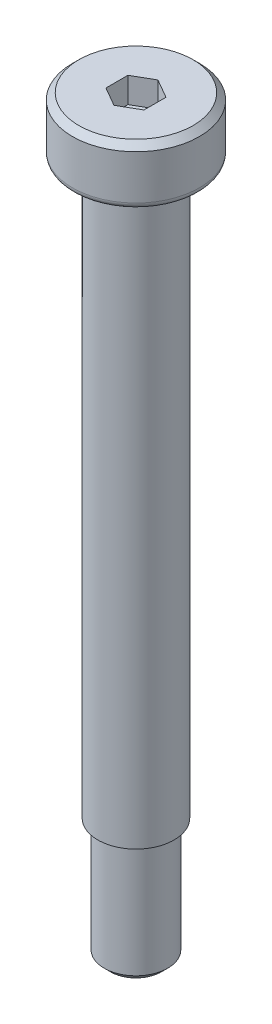
ISO-10303-21;
HEADER;
FILE_DESCRIPTION(('STEP AP214'),'2;1');
FILE_NAME('part.step','',(''),(''),'','','');
FILE_SCHEMA(('AUTOMOTIVE_DESIGN { 1 0 10303 214 1 1 1 1 }'));
ENDSEC;
DATA;
#1=APPLICATION_CONTEXT('core data for automotive mechanical design processes');
#2=APPLICATION_PROTOCOL_DEFINITION('international standard','automotive_design',2000,#1);
#3=PRODUCT_CONTEXT('',#1,'mechanical');
#4=PRODUCT('Part','Part','',(#3));
#5=PRODUCT_RELATED_PRODUCT_CATEGORY('part','',(#4));
#6=PRODUCT_DEFINITION_FORMATION('','',#4);
#7=PRODUCT_DEFINITION_CONTEXT('part definition',#1,'design');
#8=PRODUCT_DEFINITION('design','',#6,#7);
#9=PRODUCT_DEFINITION_SHAPE('','',#8);
#10=(LENGTH_UNIT() NAMED_UNIT(*) SI_UNIT(.MILLI.,.METRE.));
#11=(NAMED_UNIT(*) PLANE_ANGLE_UNIT() SI_UNIT($,.RADIAN.));
#12=(NAMED_UNIT(*) SI_UNIT($,.STERADIAN.) SOLID_ANGLE_UNIT());
#13=UNCERTAINTY_MEASURE_WITH_UNIT(LENGTH_MEASURE(1.E-05),#10,'distance_accuracy_value','');
#14=(GEOMETRIC_REPRESENTATION_CONTEXT(3) GLOBAL_UNCERTAINTY_ASSIGNED_CONTEXT((#13)) GLOBAL_UNIT_ASSIGNED_CONTEXT((#10,
#11,#12)) REPRESENTATION_CONTEXT('',''));
#15=CARTESIAN_POINT('',(0.,0.,0.));
#16=DIRECTION('',(0.,0.,1.));
#17=DIRECTION('',(1.,0.,0.));
#18=AXIS2_PLACEMENT_3D('',#15,#16,#17);
#19=CARTESIAN_POINT('',(0.,0.,0.));
#20=DIRECTION('',(0.,-1.,0.));
#21=DIRECTION('',(1.,0.,0.));
#22=AXIS2_PLACEMENT_3D('',#19,#20,#21);
#23=PLANE('',#22);
#24=CARTESIAN_POINT('',(0.,0.,0.));
#25=DIRECTION('',(0.,-1.,0.));
#26=DIRECTION('',(1.,0.,0.));
#27=AXIS2_PLACEMENT_3D('',#24,#25,#26);
#28=CIRCLE('',#27,4.5);
#29=CARTESIAN_POINT('',(4.5,0.,0.));
#30=VERTEX_POINT('',#29);
#31=EDGE_CURVE('E166',#30,#30,#28,.F.);
#32=ORIENTED_EDGE('',*,*,#31,.T.);
#33=EDGE_LOOP('',(#32));
#34=FACE_BOUND('',#33,.T.);
#35=DIRECTION('',(0.866025403784439,0.,-0.5));
#36=VECTOR('',#35,1.);
#37=CARTESIAN_POINT('',(0.,0.,1.73205080756888));
#38=LINE('',#37,#36);
#39=CARTESIAN_POINT('',(0.,0.,1.73205080756888));
#40=VERTEX_POINT('',#39);
#41=CARTESIAN_POINT('',(1.5,0.,0.866025403784439));
#42=VERTEX_POINT('',#41);
#43=EDGE_CURVE('E133',#40,#42,#38,.T.);
#44=ORIENTED_EDGE('',*,*,#43,.F.);
#45=DIRECTION('',(0.866025403784439,0.,0.5));
#46=VECTOR('',#45,1.);
#47=CARTESIAN_POINT('',(-1.5,0.,0.866025403784438));
#48=LINE('',#47,#46);
#49=CARTESIAN_POINT('',(-1.5,0.,0.866025403784438));
#50=VERTEX_POINT('',#49);
#51=EDGE_CURVE('E59',#50,#40,#48,.T.);
#52=ORIENTED_EDGE('',*,*,#51,.F.);
#53=DIRECTION('',(0.,0.,1.));
#54=VECTOR('',#53,1.);
#55=CARTESIAN_POINT('',(-1.5,0.,-0.866025403784439));
#56=LINE('',#55,#54);
#57=CARTESIAN_POINT('',(-1.5,0.,-0.866025403784439));
#58=VERTEX_POINT('',#57);
#59=EDGE_CURVE('E142',#58,#50,#56,.T.);
#60=ORIENTED_EDGE('',*,*,#59,.F.);
#61=DIRECTION('',(-0.866025403784439,0.,0.5));
#62=VECTOR('',#61,1.);
#63=CARTESIAN_POINT('',(0.,0.,-1.73205080756888));
#64=LINE('',#63,#62);
#65=CARTESIAN_POINT('',(0.,0.,-1.73205080756888));
#66=VERTEX_POINT('',#65);
#67=EDGE_CURVE('E140',#66,#58,#64,.T.);
#68=ORIENTED_EDGE('',*,*,#67,.F.);
#69=DIRECTION('',(-0.866025403784439,0.,-0.5));
#70=VECTOR('',#69,1.);
#71=CARTESIAN_POINT('',(1.5,0.,-0.86602540378444));
#72=LINE('',#71,#70);
#73=CARTESIAN_POINT('',(1.5,0.,-0.86602540378444));
#74=VERTEX_POINT('',#73);
#75=EDGE_CURVE('E107',#74,#66,#72,.T.);
#76=ORIENTED_EDGE('',*,*,#75,.F.);
#77=DIRECTION('',(0.,0.,-1.));
#78=VECTOR('',#77,1.);
#79=CARTESIAN_POINT('',(1.5,0.,0.866025403784439));
#80=LINE('',#79,#78);
#81=EDGE_CURVE('E136',#42,#74,#80,.T.);
#82=ORIENTED_EDGE('',*,*,#81,.F.);
#83=EDGE_LOOP('',(#44,#52,#60,#68,#76,#82));
#84=FACE_BOUND('',#83,.T.);
#85=ADVANCED_FACE('F43',(#34,#84),#23,.F.);
#86=CARTESIAN_POINT('',(0.,5.,0.));
#87=DIRECTION('',(0.,1.,0.));
#88=DIRECTION('',(-1.,0.,0.));
#89=AXIS2_PLACEMENT_3D('',#86,#87,#88);
#90=CYLINDRICAL_SURFACE('',#89,5.);
#91=CARTESIAN_POINT('',(0.,-4.,0.));
#92=DIRECTION('',(0.,1.,0.));
#93=DIRECTION('',(-1.,0.,0.));
#94=AXIS2_PLACEMENT_3D('',#91,#92,#93);
#95=CIRCLE('',#94,5.);
#96=CARTESIAN_POINT('',(-5.,-4.00000000000001,0.));
#97=VERTEX_POINT('',#96);
#98=EDGE_CURVE('E172',#97,#97,#95,.T.);
#99=ORIENTED_EDGE('',*,*,#98,.T.);
#100=EDGE_LOOP('',(#99));
#101=FACE_BOUND('',#100,.T.);
#102=CARTESIAN_POINT('',(0.,-0.500000000000005,0.));
#103=DIRECTION('',(0.,-1.,0.));
#104=DIRECTION('',(1.,0.,0.));
#105=AXIS2_PLACEMENT_3D('',#102,#103,#104);
#106=CIRCLE('',#105,5.);
#107=CARTESIAN_POINT('',(5.,-0.500000000000004,0.));
#108=VERTEX_POINT('',#107);
#109=EDGE_CURVE('E169',#108,#108,#106,.T.);
#110=ORIENTED_EDGE('',*,*,#109,.T.);
#111=EDGE_LOOP('',(#110));
#112=FACE_BOUND('',#111,.T.);
#113=ADVANCED_FACE('F194',(#101,#112),#90,.T.);
#114=CARTESIAN_POINT('',(5.,-4.5,0.));
#115=DIRECTION('',(0.,1.,0.));
#116=DIRECTION('',(-1.,0.,0.));
#117=AXIS2_PLACEMENT_3D('',#114,#115,#116);
#118=PLANE('',#117);
#119=CARTESIAN_POINT('',(0.,-4.5,0.));
#120=DIRECTION('',(0.,1.,0.));
#121=DIRECTION('',(-1.,0.,0.));
#122=AXIS2_PLACEMENT_3D('',#119,#120,#121);
#123=CIRCLE('',#122,4.5);
#124=CARTESIAN_POINT('',(-4.5,-4.50000000000001,0.));
#125=VERTEX_POINT('',#124);
#126=EDGE_CURVE('E175',#125,#125,#123,.F.);
#127=ORIENTED_EDGE('',*,*,#126,.T.);
#128=EDGE_LOOP('',(#127));
#129=FACE_BOUND('',#128,.T.);
#130=CARTESIAN_POINT('',(0.,-4.50000000000001,0.));
#131=DIRECTION('',(0.,1.,0.));
#132=DIRECTION('',(-1.,0.,0.));
#133=AXIS2_PLACEMENT_3D('',#130,#131,#132);
#134=CIRCLE('',#133,2.75);
#135=CARTESIAN_POINT('',(-2.75,-4.50000000000001,0.));
#136=VERTEX_POINT('',#135);
#137=EDGE_CURVE('E163',#136,#136,#134,.T.);
#138=ORIENTED_EDGE('',*,*,#137,.T.);
#139=EDGE_LOOP('',(#138));
#140=FACE_BOUND('',#139,.T.);
#141=ADVANCED_FACE('F202',(#129,#140),#118,.F.);
#142=CARTESIAN_POINT('',(0.,5.,0.));
#143=DIRECTION('',(0.,1.,0.));
#144=DIRECTION('',(-1.,0.,0.));
#145=AXIS2_PLACEMENT_3D('',#142,#143,#144);
#146=CYLINDRICAL_SURFACE('',#145,2.75);
#147=ORIENTED_EDGE('',*,*,#137,.F.);
#148=EDGE_LOOP('',(#147));
#149=FACE_BOUND('',#148,.T.);
#150=CARTESIAN_POINT('',(0.,-4.75000000000001,0.));
#151=DIRECTION('',(0.,1.,0.));
#152=DIRECTION('',(-1.,0.,0.));
#153=AXIS2_PLACEMENT_3D('',#150,#151,#152);
#154=CIRCLE('',#153,2.75);
#155=CARTESIAN_POINT('',(-2.75,-4.75000000000001,0.));
#156=VERTEX_POINT('',#155);
#157=EDGE_CURVE('E160',#156,#156,#154,.T.);
#158=ORIENTED_EDGE('',*,*,#157,.T.);
#159=EDGE_LOOP('',(#158));
#160=FACE_BOUND('',#159,.T.);
#161=ADVANCED_FACE('F256',(#149,#160),#146,.T.);
#162=CARTESIAN_POINT('',(2.75,-4.75000000000001,0.));
#163=DIRECTION('',(0.,-1.,0.));
#164=DIRECTION('',(1.,0.,0.));
#165=AXIS2_PLACEMENT_3D('',#162,#163,#164);
#166=PLANE('',#165);
#167=ORIENTED_EDGE('',*,*,#157,.F.);
#168=EDGE_LOOP('',(#167));
#169=FACE_BOUND('',#168,.T.);
#170=CARTESIAN_POINT('',(0.,-4.75000000000001,0.));
#171=DIRECTION('',(0.,1.,0.));
#172=DIRECTION('',(-1.,0.,0.));
#173=AXIS2_PLACEMENT_3D('',#170,#171,#172);
#174=CIRCLE('',#173,3.);
#175=CARTESIAN_POINT('',(-3.,-4.75000000000001,0.));
#176=VERTEX_POINT('',#175);
#177=EDGE_CURVE('E157',#176,#176,#174,.T.);
#178=ORIENTED_EDGE('',*,*,#177,.T.);
#179=EDGE_LOOP('',(#178));
#180=FACE_BOUND('',#179,.T.);
#181=ADVANCED_FACE('F252',(#169,#180),#166,.F.);
#182=CARTESIAN_POINT('',(0.,5.,0.));
#183=DIRECTION('',(0.,1.,0.));
#184=DIRECTION('',(-1.,0.,0.));
#185=AXIS2_PLACEMENT_3D('',#182,#183,#184);
#186=CYLINDRICAL_SURFACE('',#185,3.);
#187=ORIENTED_EDGE('',*,*,#177,.F.);
#188=EDGE_LOOP('',(#187));
#189=FACE_BOUND('',#188,.T.);
#190=CARTESIAN_POINT('',(0.,-49.5,0.));
#191=DIRECTION('',(0.,1.,0.));
#192=DIRECTION('',(-1.,0.,0.));
#193=AXIS2_PLACEMENT_3D('',#190,#191,#192);
#194=CIRCLE('',#193,3.00000000000001);
#195=CARTESIAN_POINT('',(-3.,-49.5,0.));
#196=VERTEX_POINT('',#195);
#197=EDGE_CURVE('E154',#196,#196,#194,.T.);
#198=ORIENTED_EDGE('',*,*,#197,.T.);
#199=EDGE_LOOP('',(#198));
#200=FACE_BOUND('',#199,.T.);
#201=ADVANCED_FACE('F248',(#189,#200),#186,.T.);
#202=CARTESIAN_POINT('',(3.00000000000001,-49.5,0.));
#203=DIRECTION('',(0.,1.,0.));
#204=DIRECTION('',(-1.,0.,0.));
#205=AXIS2_PLACEMENT_3D('',#202,#203,#204);
#206=PLANE('',#205);
#207=ORIENTED_EDGE('',*,*,#197,.F.);
#208=EDGE_LOOP('',(#207));
#209=FACE_BOUND('',#208,.T.);
#210=CARTESIAN_POINT('',(0.,-49.5,0.));
#211=DIRECTION('',(0.,1.,0.));
#212=DIRECTION('',(-1.,0.,0.));
#213=AXIS2_PLACEMENT_3D('',#210,#211,#212);
#214=CIRCLE('',#213,2.5);
#215=CARTESIAN_POINT('',(-2.49999999999999,-49.5,0.));
#216=VERTEX_POINT('',#215);
#217=EDGE_CURVE('E146',#216,#216,#214,.T.);
#218=ORIENTED_EDGE('',*,*,#217,.T.);
#219=EDGE_LOOP('',(#218));
#220=FACE_BOUND('',#219,.T.);
#221=ADVANCED_FACE('F245',(#209,#220),#206,.F.);
#222=CARTESIAN_POINT('',(0.,5.,0.));
#223=DIRECTION('',(0.,1.,0.));
#224=DIRECTION('',(-1.,0.,0.));
#225=AXIS2_PLACEMENT_3D('',#222,#223,#224);
#226=CYLINDRICAL_SURFACE('',#225,2.5);
#227=CARTESIAN_POINT('',(0.,-58.5,0.));
#228=DIRECTION('',(0.,1.,0.));
#229=DIRECTION('',(-1.,0.,0.));
#230=AXIS2_PLACEMENT_3D('',#227,#228,#229);
#231=CIRCLE('',#230,2.5);
#232=CARTESIAN_POINT('',(-2.49999999999999,-58.5,0.));
#233=VERTEX_POINT('',#232);
#234=EDGE_CURVE('E52',#233,#233,#231,.T.);
#235=ORIENTED_EDGE('',*,*,#234,.T.);
#236=EDGE_LOOP('',(#235));
#237=FACE_BOUND('',#236,.T.);
#238=ORIENTED_EDGE('',*,*,#217,.F.);
#239=EDGE_LOOP('',(#238));
#240=FACE_BOUND('',#239,.T.);
#241=ADVANCED_FACE('F180',(#237,#240),#226,.T.);
#242=CARTESIAN_POINT('',(2.50000000000001,-59.,0.));
#243=DIRECTION('',(0.,1.,0.));
#244=DIRECTION('',(-1.,0.,0.));
#245=AXIS2_PLACEMENT_3D('',#242,#243,#244);
#246=PLANE('',#245);
#247=CARTESIAN_POINT('',(0.,-59.,0.));
#248=DIRECTION('',(0.,1.,0.));
#249=DIRECTION('',(-1.,0.,0.));
#250=AXIS2_PLACEMENT_3D('',#247,#248,#249);
#251=CIRCLE('',#250,1.99999999999999);
#252=CARTESIAN_POINT('',(-1.99999999999999,-59.,0.));
#253=VERTEX_POINT('',#252);
#254=EDGE_CURVE('E11',#253,#253,#251,.F.);
#255=ORIENTED_EDGE('',*,*,#254,.T.);
#256=EDGE_LOOP('',(#255));
#257=FACE_BOUND('',#256,.T.);
#258=ADVANCED_FACE('F240',(#257),#246,.F.);
#259=CARTESIAN_POINT('',(-1.5,-2.,0.866025403784438));
#260=DIRECTION('',(-0.5,0.,0.866025403784439));
#261=DIRECTION('',(0.866025403784439,0.,0.5));
#262=AXIS2_PLACEMENT_3D('',#259,#260,#261);
#263=PLANE('',#262);
#264=ORIENTED_EDGE('',*,*,#51,.T.);
#265=DIRECTION('',(0.,1.,0.));
#266=VECTOR('',#265,1.);
#267=CARTESIAN_POINT('',(0.,-2.,1.73205080756888));
#268=LINE('',#267,#266);
#269=CARTESIAN_POINT('',(0.,-2.,1.73205080756888));
#270=VERTEX_POINT('',#269);
#271=EDGE_CURVE('E89',#270,#40,#268,.T.);
#272=ORIENTED_EDGE('',*,*,#271,.F.);
#273=DIRECTION('',(0.866025403784439,0.,0.5));
#274=VECTOR('',#273,1.);
#275=CARTESIAN_POINT('',(-1.5,-2.,0.866025403784438));
#276=LINE('',#275,#274);
#277=CARTESIAN_POINT('',(-1.5,-2.,0.866025403784438));
#278=VERTEX_POINT('',#277);
#279=EDGE_CURVE('E144',#278,#270,#276,.T.);
#280=ORIENTED_EDGE('',*,*,#279,.F.);
#281=DIRECTION('',(0.,1.,0.));
#282=VECTOR('',#281,1.);
#283=CARTESIAN_POINT('',(-1.5,-2.,0.866025403784438));
#284=LINE('',#283,#282);
#285=EDGE_CURVE('E67',#278,#50,#284,.T.);
#286=ORIENTED_EDGE('',*,*,#285,.T.);
#287=EDGE_LOOP('',(#264,#272,#280,#286));
#288=FACE_BOUND('',#287,.T.);
#289=ADVANCED_FACE('F230',(#288),#263,.F.);
#290=CARTESIAN_POINT('',(-1.5,-2.,-0.866025403784439));
#291=DIRECTION('',(-1.,0.,0.));
#292=DIRECTION('',(0.,-1.,0.));
#293=AXIS2_PLACEMENT_3D('',#290,#291,#292);
#294=PLANE('',#293);
#295=ORIENTED_EDGE('',*,*,#59,.T.);
#296=ORIENTED_EDGE('',*,*,#285,.F.);
#297=DIRECTION('',(0.,0.,1.));
#298=VECTOR('',#297,1.);
#299=CARTESIAN_POINT('',(-1.5,-2.,-0.866025403784439));
#300=LINE('',#299,#298);
#301=CARTESIAN_POINT('',(-1.5,-2.,-0.866025403784439));
#302=VERTEX_POINT('',#301);
#303=EDGE_CURVE('E119',#302,#278,#300,.T.);
#304=ORIENTED_EDGE('',*,*,#303,.F.);
#305=DIRECTION('',(0.,1.,0.));
#306=VECTOR('',#305,1.);
#307=CARTESIAN_POINT('',(-1.5,-2.,-0.866025403784439));
#308=LINE('',#307,#306);
#309=EDGE_CURVE('E111',#302,#58,#308,.T.);
#310=ORIENTED_EDGE('',*,*,#309,.T.);
#311=EDGE_LOOP('',(#295,#296,#304,#310));
#312=FACE_BOUND('',#311,.T.);
#313=ADVANCED_FACE('F227',(#312),#294,.F.);
#314=CARTESIAN_POINT('',(0.,-2.,-1.73205080756888));
#315=DIRECTION('',(-0.5,0.,-0.866025403784439));
#316=DIRECTION('',(-0.866025403784439,0.,0.5));
#317=AXIS2_PLACEMENT_3D('',#314,#315,#316);
#318=PLANE('',#317);
#319=ORIENTED_EDGE('',*,*,#67,.T.);
#320=ORIENTED_EDGE('',*,*,#309,.F.);
#321=DIRECTION('',(-0.866025403784439,0.,0.5));
#322=VECTOR('',#321,1.);
#323=CARTESIAN_POINT('',(0.,-2.,-1.73205080756888));
#324=LINE('',#323,#322);
#325=CARTESIAN_POINT('',(0.,-2.,-1.73205080756888));
#326=VERTEX_POINT('',#325);
#327=EDGE_CURVE('E115',#326,#302,#324,.T.);
#328=ORIENTED_EDGE('',*,*,#327,.F.);
#329=DIRECTION('',(0.,1.,0.));
#330=VECTOR('',#329,1.);
#331=CARTESIAN_POINT('',(0.,-2.,-1.73205080756888));
#332=LINE('',#331,#330);
#333=EDGE_CURVE('E100',#326,#66,#332,.T.);
#334=ORIENTED_EDGE('',*,*,#333,.T.);
#335=EDGE_LOOP('',(#319,#320,#328,#334));
#336=FACE_BOUND('',#335,.T.);
#337=ADVANCED_FACE('F116',(#336),#318,.F.);
#338=CARTESIAN_POINT('',(1.5,-2.,-0.86602540378444));
#339=DIRECTION('',(0.5,0.,-0.866025403784439));
#340=DIRECTION('',(-0.866025403784439,0.,-0.5));
#341=AXIS2_PLACEMENT_3D('',#338,#339,#340);
#342=PLANE('',#341);
#343=ORIENTED_EDGE('',*,*,#75,.T.);
#344=ORIENTED_EDGE('',*,*,#333,.F.);
#345=DIRECTION('',(-0.866025403784439,0.,-0.5));
#346=VECTOR('',#345,1.);
#347=CARTESIAN_POINT('',(1.5,-2.,-0.86602540378444));
#348=LINE('',#347,#346);
#349=CARTESIAN_POINT('',(1.5,-2.,-0.86602540378444));
#350=VERTEX_POINT('',#349);
#351=EDGE_CURVE('E104',#350,#326,#348,.T.);
#352=ORIENTED_EDGE('',*,*,#351,.F.);
#353=DIRECTION('',(0.,1.,0.));
#354=VECTOR('',#353,1.);
#355=CARTESIAN_POINT('',(1.5,-2.,-0.86602540378444));
#356=LINE('',#355,#354);
#357=EDGE_CURVE('E112',#350,#74,#356,.T.);
#358=ORIENTED_EDGE('',*,*,#357,.T.);
#359=EDGE_LOOP('',(#343,#344,#352,#358));
#360=FACE_BOUND('',#359,.T.);
#361=ADVANCED_FACE('F102',(#360),#342,.F.);
#362=CARTESIAN_POINT('',(1.5,-2.,0.866025403784439));
#363=DIRECTION('',(1.,0.,0.));
#364=DIRECTION('',(0.,1.,0.));
#365=AXIS2_PLACEMENT_3D('',#362,#363,#364);
#366=PLANE('',#365);
#367=ORIENTED_EDGE('',*,*,#81,.T.);
#368=ORIENTED_EDGE('',*,*,#357,.F.);
#369=DIRECTION('',(0.,0.,-1.));
#370=VECTOR('',#369,1.);
#371=CARTESIAN_POINT('',(1.5,-2.,0.866025403784439));
#372=LINE('',#371,#370);
#373=CARTESIAN_POINT('',(1.5,-2.,0.866025403784439));
#374=VERTEX_POINT('',#373);
#375=EDGE_CURVE('E125',#374,#350,#372,.T.);
#376=ORIENTED_EDGE('',*,*,#375,.F.);
#377=DIRECTION('',(0.,1.,0.));
#378=VECTOR('',#377,1.);
#379=CARTESIAN_POINT('',(1.5,-2.,0.866025403784439));
#380=LINE('',#379,#378);
#381=EDGE_CURVE('E149',#374,#42,#380,.T.);
#382=ORIENTED_EDGE('',*,*,#381,.T.);
#383=EDGE_LOOP('',(#367,#368,#376,#382));
#384=FACE_BOUND('',#383,.T.);
#385=ADVANCED_FACE('F223',(#384),#366,.F.);
#386=CARTESIAN_POINT('',(0.,-2.,1.73205080756888));
#387=DIRECTION('',(0.5,0.,0.866025403784439));
#388=DIRECTION('',(0.866025403784439,0.,-0.5));
#389=AXIS2_PLACEMENT_3D('',#386,#387,#388);
#390=PLANE('',#389);
#391=ORIENTED_EDGE('',*,*,#43,.T.);
#392=ORIENTED_EDGE('',*,*,#381,.F.);
#393=DIRECTION('',(0.866025403784439,0.,-0.5));
#394=VECTOR('',#393,1.);
#395=CARTESIAN_POINT('',(0.,-2.,1.73205080756888));
#396=LINE('',#395,#394);
#397=EDGE_CURVE('E127',#270,#374,#396,.T.);
#398=ORIENTED_EDGE('',*,*,#397,.F.);
#399=ORIENTED_EDGE('',*,*,#271,.T.);
#400=EDGE_LOOP('',(#391,#392,#398,#399));
#401=FACE_BOUND('',#400,.T.);
#402=ADVANCED_FACE('F214',(#401),#390,.F.);
#403=CARTESIAN_POINT('',(0.,-2.,0.));
#404=DIRECTION('',(0.,1.,0.));
#405=DIRECTION('',(-1.,0.,0.));
#406=AXIS2_PLACEMENT_3D('',#403,#404,#405);
#407=PLANE('',#406);
#408=ORIENTED_EDGE('',*,*,#279,.T.);
#409=ORIENTED_EDGE('',*,*,#397,.T.);
#410=ORIENTED_EDGE('',*,*,#375,.T.);
#411=ORIENTED_EDGE('',*,*,#351,.T.);
#412=ORIENTED_EDGE('',*,*,#327,.T.);
#413=ORIENTED_EDGE('',*,*,#303,.T.);
#414=EDGE_LOOP('',(#408,#409,#410,#411,#412,#413));
#415=FACE_BOUND('',#414,.T.);
#416=ADVANCED_FACE('F122',(#415),#407,.T.);
#417=CARTESIAN_POINT('',(0.,0.,0.));
#418=DIRECTION('',(0.,-1.,0.));
#419=DIRECTION('',(1.,0.,0.));
#420=AXIS2_PLACEMENT_3D('',#417,#418,#419);
#421=CONICAL_SURFACE('',#420,4.5,0.785398163397445);
#422=ORIENTED_EDGE('',*,*,#109,.F.);
#423=EDGE_LOOP('',(#422));
#424=FACE_BOUND('',#423,.T.);
#425=ORIENTED_EDGE('',*,*,#31,.F.);
#426=EDGE_LOOP('',(#425));
#427=FACE_BOUND('',#426,.T.);
#428=ADVANCED_FACE('F190',(#424,#427),#421,.T.);
#429=CARTESIAN_POINT('',(0.,-4.,0.));
#430=DIRECTION('',(0.,1.,0.));
#431=DIRECTION('',(-1.,0.,0.));
#432=AXIS2_PLACEMENT_3D('',#429,#430,#431);
#433=TOROIDAL_SURFACE('',#432,4.5,0.5);
#434=ORIENTED_EDGE('',*,*,#126,.F.);
#435=EDGE_LOOP('',(#434));
#436=FACE_BOUND('',#435,.T.);
#437=ORIENTED_EDGE('',*,*,#98,.F.);
#438=EDGE_LOOP('',(#437));
#439=FACE_BOUND('',#438,.T.);
#440=ADVANCED_FACE('F184',(#436,#439),#433,.T.);
#441=CARTESIAN_POINT('',(0.,-58.5,0.));
#442=DIRECTION('',(0.,1.,0.));
#443=DIRECTION('',(-1.,0.,0.));
#444=AXIS2_PLACEMENT_3D('',#441,#442,#443);
#445=CONICAL_SURFACE('',#444,2.5,0.785398163397447);
#446=ORIENTED_EDGE('',*,*,#254,.F.);
#447=EDGE_LOOP('',(#446));
#448=FACE_BOUND('',#447,.T.);
#449=ORIENTED_EDGE('',*,*,#234,.F.);
#450=EDGE_LOOP('',(#449));
#451=FACE_BOUND('',#450,.T.);
#452=ADVANCED_FACE('F46',(#448,#451),#445,.T.);
#453=CLOSED_SHELL('',(#85,#113,#141,#161,#181,#201,#221,#241,#258,#289,#313,#337,#361,#385,#402,
#416,#428,#440,#452));
#454=MANIFOLD_SOLID_BREP('B2',#453);
#455=ADVANCED_BREP_SHAPE_REPRESENTATION('',(#18,#454),#14);
#456=SHAPE_DEFINITION_REPRESENTATION(#9,#455);
ENDSEC;
END-ISO-10303-21;
